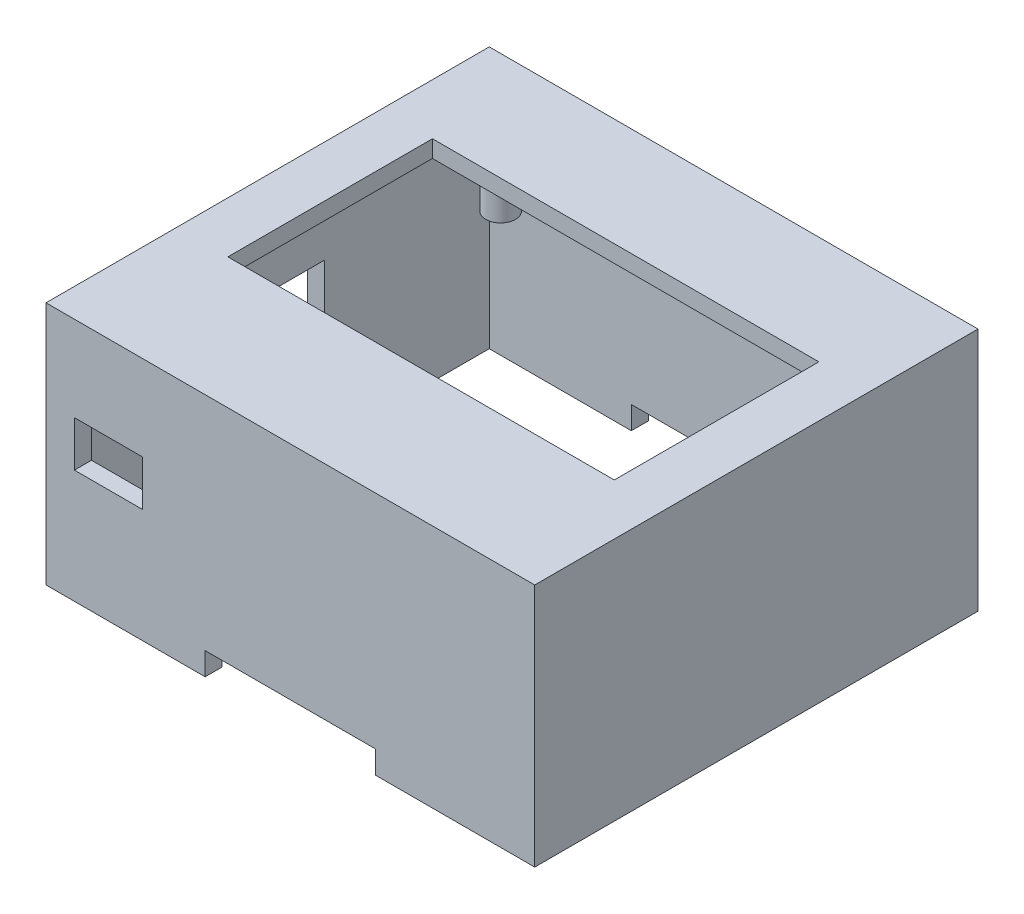
ISO-10303-21;
HEADER;
FILE_DESCRIPTION(('STEP AP214'),'2;1');
FILE_NAME('part.step','',(''),(''),'','','');
FILE_SCHEMA(('AUTOMOTIVE_DESIGN { 1 0 10303 214 1 1 1 1 }'));
ENDSEC;
DATA;
#1=APPLICATION_CONTEXT('core data for automotive mechanical design processes');
#2=APPLICATION_PROTOCOL_DEFINITION('international standard','automotive_design',2000,#1);
#3=PRODUCT_CONTEXT('',#1,'mechanical');
#4=PRODUCT('Part','Part','',(#3));
#5=PRODUCT_RELATED_PRODUCT_CATEGORY('part','',(#4));
#6=PRODUCT_DEFINITION_FORMATION('','',#4);
#7=PRODUCT_DEFINITION_CONTEXT('part definition',#1,'design');
#8=PRODUCT_DEFINITION('design','',#6,#7);
#9=PRODUCT_DEFINITION_SHAPE('','',#8);
#10=(LENGTH_UNIT() NAMED_UNIT(*) SI_UNIT(.MILLI.,.METRE.));
#11=(NAMED_UNIT(*) PLANE_ANGLE_UNIT() SI_UNIT($,.RADIAN.));
#12=(NAMED_UNIT(*) SI_UNIT($,.STERADIAN.) SOLID_ANGLE_UNIT());
#13=UNCERTAINTY_MEASURE_WITH_UNIT(LENGTH_MEASURE(1.E-05),#10,'distance_accuracy_value','');
#14=(GEOMETRIC_REPRESENTATION_CONTEXT(3) GLOBAL_UNCERTAINTY_ASSIGNED_CONTEXT((#13)) GLOBAL_UNIT_ASSIGNED_CONTEXT((#10,
#11,#12)) REPRESENTATION_CONTEXT('',''));
#15=CARTESIAN_POINT('',(0.,0.,0.));
#16=DIRECTION('',(0.,0.,1.));
#17=DIRECTION('',(1.,0.,0.));
#18=AXIS2_PLACEMENT_3D('',#15,#16,#17);
#19=CARTESIAN_POINT('',(-21.5,1.5,-19.5));
#20=DIRECTION('',(0.,0.,1.));
#21=DIRECTION('',(1.,0.,0.));
#22=AXIS2_PLACEMENT_3D('',#19,#20,#21);
#23=PLANE('',#22);
#24=DIRECTION('',(0.,-1.,0.));
#25=VECTOR('',#24,1.);
#26=CARTESIAN_POINT('',(7.5,-18.,-19.5));
#27=LINE('',#26,#25);
#28=CARTESIAN_POINT('',(7.5,-18.,-19.5));
#29=VERTEX_POINT('',#28);
#30=CARTESIAN_POINT('',(7.5,-20.,-19.5));
#31=VERTEX_POINT('',#30);
#32=EDGE_CURVE('E255',#29,#31,#27,.T.);
#33=ORIENTED_EDGE('',*,*,#32,.F.);
#34=DIRECTION('',(1.,0.,0.));
#35=VECTOR('',#34,1.);
#36=CARTESIAN_POINT('',(0.,-18.,-19.5));
#37=LINE('',#36,#35);
#38=CARTESIAN_POINT('',(-7.5,-18.,-19.5));
#39=VERTEX_POINT('',#38);
#40=EDGE_CURVE('E237',#39,#29,#37,.T.);
#41=ORIENTED_EDGE('',*,*,#40,.F.);
#42=DIRECTION('',(0.,-1.,0.));
#43=VECTOR('',#42,1.);
#44=CARTESIAN_POINT('',(-7.5,-18.,-19.5));
#45=LINE('',#44,#43);
#46=CARTESIAN_POINT('',(-7.5,-20.,-19.5));
#47=VERTEX_POINT('',#46);
#48=EDGE_CURVE('E234',#39,#47,#45,.T.);
#49=ORIENTED_EDGE('',*,*,#48,.T.);
#50=DIRECTION('',(1.,0.,0.));
#51=VECTOR('',#50,1.);
#52=CARTESIAN_POINT('',(-21.5,-20.,-19.5));
#53=LINE('',#52,#51);
#54=CARTESIAN_POINT('',(-21.5,-20.,-19.5));
#55=VERTEX_POINT('',#54);
#56=EDGE_CURVE('E426',#55,#47,#53,.T.);
#57=ORIENTED_EDGE('',*,*,#56,.F.);
#58=DIRECTION('',(0.,-1.,0.));
#59=VECTOR('',#58,1.);
#60=CARTESIAN_POINT('',(-21.5,1.5,-19.5));
#61=LINE('',#60,#59);
#62=CARTESIAN_POINT('',(-21.5,1.5,-19.5));
#63=VERTEX_POINT('',#62);
#64=EDGE_CURVE('E514',#63,#55,#61,.T.);
#65=ORIENTED_EDGE('',*,*,#64,.F.);
#66=DIRECTION('',(-1.,0.,0.));
#67=VECTOR('',#66,1.);
#68=CARTESIAN_POINT('',(-21.5,1.5,-19.5));
#69=LINE('',#68,#67);
#70=CARTESIAN_POINT('',(21.5,1.5,-19.5));
#71=VERTEX_POINT('',#70);
#72=EDGE_CURVE('E498',#71,#63,#69,.T.);
#73=ORIENTED_EDGE('',*,*,#72,.F.);
#74=DIRECTION('',(0.,-1.,0.));
#75=VECTOR('',#74,1.);
#76=CARTESIAN_POINT('',(21.5,1.5,-19.5));
#77=LINE('',#76,#75);
#78=CARTESIAN_POINT('',(21.5,-20.,-19.5));
#79=VERTEX_POINT('',#78);
#80=EDGE_CURVE('E517',#71,#79,#77,.T.);
#81=ORIENTED_EDGE('',*,*,#80,.T.);
#82=EDGE_CURVE('E425',#31,#79,#53,.T.);
#83=ORIENTED_EDGE('',*,*,#82,.F.);
#84=EDGE_LOOP('',(#33,#41,#49,#57,#65,#73,#81,#83));
#85=FACE_BOUND('',#84,.T.);
#86=ADVANCED_FACE('F41',(#85),#23,.F.);
#87=CARTESIAN_POINT('',(-21.5,1.5,19.5));
#88=DIRECTION('',(0.,0.,-1.));
#89=DIRECTION('',(-1.,0.,0.));
#90=AXIS2_PLACEMENT_3D('',#87,#88,#89);
#91=PLANE('',#90);
#92=DIRECTION('',(1.,0.,0.));
#93=VECTOR('',#92,1.);
#94=CARTESIAN_POINT('',(-13.,-10.,19.5));
#95=LINE('',#94,#93);
#96=CARTESIAN_POINT('',(-19.,-10.,19.5));
#97=VERTEX_POINT('',#96);
#98=CARTESIAN_POINT('',(-13.,-10.,19.5));
#99=VERTEX_POINT('',#98);
#100=EDGE_CURVE('E308',#97,#99,#95,.T.);
#101=ORIENTED_EDGE('',*,*,#100,.F.);
#102=DIRECTION('',(0.,-1.,0.));
#103=VECTOR('',#102,1.);
#104=CARTESIAN_POINT('',(-19.,-10.,19.5));
#105=LINE('',#104,#103);
#106=CARTESIAN_POINT('',(-19.,-6.,19.5));
#107=VERTEX_POINT('',#106);
#108=EDGE_CURVE('E312',#107,#97,#105,.T.);
#109=ORIENTED_EDGE('',*,*,#108,.F.);
#110=DIRECTION('',(-1.,0.,0.));
#111=VECTOR('',#110,1.);
#112=CARTESIAN_POINT('',(-13.,-6.,19.5));
#113=LINE('',#112,#111);
#114=CARTESIAN_POINT('',(-13.,-6.,19.5));
#115=VERTEX_POINT('',#114);
#116=EDGE_CURVE('E299',#115,#107,#113,.T.);
#117=ORIENTED_EDGE('',*,*,#116,.F.);
#118=DIRECTION('',(0.,1.,0.));
#119=VECTOR('',#118,1.);
#120=CARTESIAN_POINT('',(-13.,-10.,19.5));
#121=LINE('',#120,#119);
#122=EDGE_CURVE('E304',#99,#115,#121,.T.);
#123=ORIENTED_EDGE('',*,*,#122,.F.);
#124=EDGE_LOOP('',(#101,#109,#117,#123));
#125=FACE_BOUND('',#124,.T.);
#126=DIRECTION('',(0.,-1.,0.));
#127=VECTOR('',#126,1.);
#128=CARTESIAN_POINT('',(7.5,-18.,19.5));
#129=LINE('',#128,#127);
#130=CARTESIAN_POINT('',(7.5,-18.,19.5));
#131=VERTEX_POINT('',#130);
#132=CARTESIAN_POINT('',(7.5,-20.,19.5));
#133=VERTEX_POINT('',#132);
#134=EDGE_CURVE('E272',#131,#133,#129,.T.);
#135=ORIENTED_EDGE('',*,*,#134,.T.);
#136=DIRECTION('',(-1.,0.,0.));
#137=VECTOR('',#136,1.);
#138=CARTESIAN_POINT('',(21.5,-20.,19.5));
#139=LINE('',#138,#137);
#140=CARTESIAN_POINT('',(21.5,-20.,19.5));
#141=VERTEX_POINT('',#140);
#142=EDGE_CURVE('E435',#141,#133,#139,.T.);
#143=ORIENTED_EDGE('',*,*,#142,.F.);
#144=DIRECTION('',(0.,-1.,0.));
#145=VECTOR('',#144,1.);
#146=CARTESIAN_POINT('',(21.5,1.5,19.5));
#147=LINE('',#146,#145);
#148=CARTESIAN_POINT('',(21.5,1.5,19.5));
#149=VERTEX_POINT('',#148);
#150=EDGE_CURVE('E507',#149,#141,#147,.T.);
#151=ORIENTED_EDGE('',*,*,#150,.F.);
#152=DIRECTION('',(1.,0.,0.));
#153=VECTOR('',#152,1.);
#154=CARTESIAN_POINT('',(-21.5,1.5,19.5));
#155=LINE('',#154,#153);
#156=CARTESIAN_POINT('',(-21.5,1.5,19.5));
#157=VERTEX_POINT('',#156);
#158=EDGE_CURVE('E504',#157,#149,#155,.T.);
#159=ORIENTED_EDGE('',*,*,#158,.F.);
#160=DIRECTION('',(0.,-1.,0.));
#161=VECTOR('',#160,1.);
#162=CARTESIAN_POINT('',(-21.5,1.5,19.5));
#163=LINE('',#162,#161);
#164=CARTESIAN_POINT('',(-21.5,-20.,19.5));
#165=VERTEX_POINT('',#164);
#166=EDGE_CURVE('E510',#157,#165,#163,.T.);
#167=ORIENTED_EDGE('',*,*,#166,.T.);
#168=CARTESIAN_POINT('',(-7.5,-20.,19.5));
#169=VERTEX_POINT('',#168);
#170=EDGE_CURVE('E434',#169,#165,#139,.T.);
#171=ORIENTED_EDGE('',*,*,#170,.F.);
#172=DIRECTION('',(0.,-1.,0.));
#173=VECTOR('',#172,1.);
#174=CARTESIAN_POINT('',(-7.5,-18.,19.5));
#175=LINE('',#174,#173);
#176=CARTESIAN_POINT('',(-7.5,-18.,19.5));
#177=VERTEX_POINT('',#176);
#178=EDGE_CURVE('E287',#177,#169,#175,.T.);
#179=ORIENTED_EDGE('',*,*,#178,.F.);
#180=DIRECTION('',(-1.,0.,0.));
#181=VECTOR('',#180,1.);
#182=CARTESIAN_POINT('',(0.,-18.,19.5));
#183=LINE('',#182,#181);
#184=EDGE_CURVE('E263',#131,#177,#183,.T.);
#185=ORIENTED_EDGE('',*,*,#184,.F.);
#186=EDGE_LOOP('',(#135,#143,#151,#159,#167,#171,#179,#185));
#187=FACE_BOUND('',#186,.T.);
#188=ADVANCED_FACE('F544',(#125,#187),#91,.F.);
#189=CARTESIAN_POINT('',(0.,-20.,0.));
#190=DIRECTION('',(0.,-1.,0.));
#191=DIRECTION('',(0.,0.,-1.));
#192=AXIS2_PLACEMENT_3D('',#189,#190,#191);
#193=PLANE('',#192);
#194=DIRECTION('',(1.,0.,0.));
#195=VECTOR('',#194,1.);
#196=CARTESIAN_POINT('',(-20.,-20.,-18.));
#197=LINE('',#196,#195);
#198=CARTESIAN_POINT('',(7.5,-20.,-18.));
#199=VERTEX_POINT('',#198);
#200=CARTESIAN_POINT('',(20.,-20.,-18.));
#201=VERTEX_POINT('',#200);
#202=EDGE_CURVE('E395',#199,#201,#197,.T.);
#203=ORIENTED_EDGE('',*,*,#202,.F.);
#204=DIRECTION('',(0.,0.,-1.));
#205=VECTOR('',#204,1.);
#206=CARTESIAN_POINT('',(7.5,-20.,0.));
#207=LINE('',#206,#205);
#208=EDGE_CURVE('E282',#199,#31,#207,.T.);
#209=ORIENTED_EDGE('',*,*,#208,.T.);
#210=ORIENTED_EDGE('',*,*,#82,.T.);
#211=DIRECTION('',(0.,0.,1.));
#212=VECTOR('',#211,1.);
#213=CARTESIAN_POINT('',(21.5,-20.,-19.5));
#214=LINE('',#213,#212);
#215=EDGE_CURVE('E430',#79,#141,#214,.T.);
#216=ORIENTED_EDGE('',*,*,#215,.T.);
#217=ORIENTED_EDGE('',*,*,#142,.T.);
#218=DIRECTION('',(0.,0.,-1.));
#219=VECTOR('',#218,1.);
#220=CARTESIAN_POINT('',(7.5,-20.,0.));
#221=LINE('',#220,#219);
#222=CARTESIAN_POINT('',(7.5,-20.,18.));
#223=VERTEX_POINT('',#222);
#224=EDGE_CURVE('E273',#133,#223,#221,.T.);
#225=ORIENTED_EDGE('',*,*,#224,.T.);
#226=DIRECTION('',(-1.,0.,0.));
#227=VECTOR('',#226,1.);
#228=CARTESIAN_POINT('',(20.,-20.,18.));
#229=LINE('',#228,#227);
#230=CARTESIAN_POINT('',(20.,-20.,18.));
#231=VERTEX_POINT('',#230);
#232=EDGE_CURVE('E387',#231,#223,#229,.T.);
#233=ORIENTED_EDGE('',*,*,#232,.F.);
#234=DIRECTION('',(0.,0.,1.));
#235=VECTOR('',#234,1.);
#236=CARTESIAN_POINT('',(20.,-20.,-18.));
#237=LINE('',#236,#235);
#238=EDGE_CURVE('E382',#201,#231,#237,.T.);
#239=ORIENTED_EDGE('',*,*,#238,.F.);
#240=EDGE_LOOP('',(#203,#209,#210,#216,#217,#225,#233,#239));
#241=FACE_BOUND('',#240,.T.);
#242=ADVANCED_FACE('F549',(#241),#193,.T.);
#243=DIRECTION('',(0.,0.,-1.));
#244=VECTOR('',#243,1.);
#245=CARTESIAN_POINT('',(-7.5,-20.,0.));
#246=LINE('',#245,#244);
#247=CARTESIAN_POINT('',(-7.5,-20.,-18.));
#248=VERTEX_POINT('',#247);
#249=EDGE_CURVE('E579',#248,#47,#246,.T.);
#250=ORIENTED_EDGE('',*,*,#249,.F.);
#251=CARTESIAN_POINT('',(-20.,-20.,-18.));
#252=VERTEX_POINT('',#251);
#253=EDGE_CURVE('E249',#252,#248,#197,.T.);
#254=ORIENTED_EDGE('',*,*,#253,.F.);
#255=DIRECTION('',(0.,0.,-1.));
#256=VECTOR('',#255,1.);
#257=CARTESIAN_POINT('',(-20.,-20.,18.));
#258=LINE('',#257,#256);
#259=CARTESIAN_POINT('',(-20.,-20.,18.));
#260=VERTEX_POINT('',#259);
#261=EDGE_CURVE('E391',#260,#252,#258,.T.);
#262=ORIENTED_EDGE('',*,*,#261,.F.);
#263=CARTESIAN_POINT('',(-7.5,-20.,18.));
#264=VERTEX_POINT('',#263);
#265=EDGE_CURVE('E385',#264,#260,#229,.T.);
#266=ORIENTED_EDGE('',*,*,#265,.F.);
#267=DIRECTION('',(0.,0.,-1.));
#268=VECTOR('',#267,1.);
#269=CARTESIAN_POINT('',(-7.5,-20.,0.));
#270=LINE('',#269,#268);
#271=EDGE_CURVE('E264',#169,#264,#270,.T.);
#272=ORIENTED_EDGE('',*,*,#271,.F.);
#273=ORIENTED_EDGE('',*,*,#170,.T.);
#274=DIRECTION('',(0.,0.,-1.));
#275=VECTOR('',#274,1.);
#276=CARTESIAN_POINT('',(-21.5,-20.,19.5));
#277=LINE('',#276,#275);
#278=EDGE_CURVE('E439',#165,#55,#277,.T.);
#279=ORIENTED_EDGE('',*,*,#278,.T.);
#280=ORIENTED_EDGE('',*,*,#56,.T.);
#281=EDGE_LOOP('',(#250,#254,#262,#266,#272,#273,#279,#280));
#282=FACE_BOUND('',#281,.T.);
#283=ADVANCED_FACE('F569',(#282),#193,.T.);
#284=CARTESIAN_POINT('',(20.,-20.,18.));
#285=DIRECTION('',(0.,0.,-1.));
#286=DIRECTION('',(-1.,0.,0.));
#287=AXIS2_PLACEMENT_3D('',#284,#285,#286);
#288=PLANE('',#287);
#289=DIRECTION('',(0.,-1.,0.));
#290=VECTOR('',#289,1.);
#291=CARTESIAN_POINT('',(-19.,-10.,18.));
#292=LINE('',#291,#290);
#293=CARTESIAN_POINT('',(-19.,-6.,18.));
#294=VERTEX_POINT('',#293);
#295=CARTESIAN_POINT('',(-19.,-10.,18.));
#296=VERTEX_POINT('',#295);
#297=EDGE_CURVE('E315',#294,#296,#292,.T.);
#298=ORIENTED_EDGE('',*,*,#297,.T.);
#299=DIRECTION('',(1.,0.,0.));
#300=VECTOR('',#299,1.);
#301=CARTESIAN_POINT('',(-13.,-10.,18.));
#302=LINE('',#301,#300);
#303=CARTESIAN_POINT('',(-13.,-10.,18.));
#304=VERTEX_POINT('',#303);
#305=EDGE_CURVE('E293',#296,#304,#302,.T.);
#306=ORIENTED_EDGE('',*,*,#305,.T.);
#307=DIRECTION('',(0.,1.,0.));
#308=VECTOR('',#307,1.);
#309=CARTESIAN_POINT('',(-13.,-10.,18.));
#310=LINE('',#309,#308);
#311=CARTESIAN_POINT('',(-13.,-6.,18.));
#312=VERTEX_POINT('',#311);
#313=EDGE_CURVE('E325',#304,#312,#310,.T.);
#314=ORIENTED_EDGE('',*,*,#313,.T.);
#315=DIRECTION('',(-1.,0.,0.));
#316=VECTOR('',#315,1.);
#317=CARTESIAN_POINT('',(-13.,-6.,18.));
#318=LINE('',#317,#316);
#319=EDGE_CURVE('E320',#312,#294,#318,.T.);
#320=ORIENTED_EDGE('',*,*,#319,.T.);
#321=EDGE_LOOP('',(#298,#306,#314,#320));
#322=FACE_BOUND('',#321,.T.);
#323=ORIENTED_EDGE('',*,*,#232,.T.);
#324=DIRECTION('',(0.,-1.,0.));
#325=VECTOR('',#324,1.);
#326=CARTESIAN_POINT('',(7.5,-18.,18.));
#327=LINE('',#326,#325);
#328=CARTESIAN_POINT('',(7.5,-18.,18.));
#329=VERTEX_POINT('',#328);
#330=EDGE_CURVE('E279',#329,#223,#327,.T.);
#331=ORIENTED_EDGE('',*,*,#330,.F.);
#332=DIRECTION('',(1.,0.,0.));
#333=VECTOR('',#332,1.);
#334=CARTESIAN_POINT('',(0.,-18.,18.));
#335=LINE('',#334,#333);
#336=CARTESIAN_POINT('',(-7.5,-18.,18.));
#337=VERTEX_POINT('',#336);
#338=EDGE_CURVE('E269',#337,#329,#335,.T.);
#339=ORIENTED_EDGE('',*,*,#338,.F.);
#340=DIRECTION('',(0.,-1.,0.));
#341=VECTOR('',#340,1.);
#342=CARTESIAN_POINT('',(-7.5,-18.,18.));
#343=LINE('',#342,#341);
#344=EDGE_CURVE('E283',#337,#264,#343,.T.);
#345=ORIENTED_EDGE('',*,*,#344,.T.);
#346=ORIENTED_EDGE('',*,*,#265,.T.);
#347=DIRECTION('',(0.,1.,0.));
#348=VECTOR('',#347,1.);
#349=CARTESIAN_POINT('',(-20.,-20.,18.));
#350=LINE('',#349,#348);
#351=CARTESIAN_POINT('',(-20.,0.,18.));
#352=VERTEX_POINT('',#351);
#353=EDGE_CURVE('E418',#260,#352,#350,.T.);
#354=ORIENTED_EDGE('',*,*,#353,.T.);
#355=DIRECTION('',(-1.,0.,0.));
#356=VECTOR('',#355,1.);
#357=CARTESIAN_POINT('',(20.,0.,18.));
#358=LINE('',#357,#356);
#359=CARTESIAN_POINT('',(20.,0.,18.));
#360=VERTEX_POINT('',#359);
#361=EDGE_CURVE('E402',#360,#352,#358,.T.);
#362=ORIENTED_EDGE('',*,*,#361,.F.);
#363=DIRECTION('',(0.,1.,0.));
#364=VECTOR('',#363,1.);
#365=CARTESIAN_POINT('',(20.,-20.,18.));
#366=LINE('',#365,#364);
#367=EDGE_CURVE('E421',#231,#360,#366,.T.);
#368=ORIENTED_EDGE('',*,*,#367,.F.);
#369=EDGE_LOOP('',(#323,#331,#339,#345,#346,#354,#362,#368));
#370=FACE_BOUND('',#369,.T.);
#371=ADVANCED_FACE('F595',(#322,#370),#288,.T.);
#372=CARTESIAN_POINT('',(-20.,-20.,-18.));
#373=DIRECTION('',(0.,0.,1.));
#374=DIRECTION('',(1.,0.,0.));
#375=AXIS2_PLACEMENT_3D('',#372,#373,#374);
#376=PLANE('',#375);
#377=DIRECTION('',(-1.,0.,0.));
#378=VECTOR('',#377,1.);
#379=CARTESIAN_POINT('',(0.,-18.,-18.));
#380=LINE('',#379,#378);
#381=CARTESIAN_POINT('',(7.5,-18.,-18.));
#382=VERTEX_POINT('',#381);
#383=CARTESIAN_POINT('',(-7.5,-18.,-18.));
#384=VERTEX_POINT('',#383);
#385=EDGE_CURVE('E238',#382,#384,#380,.T.);
#386=ORIENTED_EDGE('',*,*,#385,.F.);
#387=DIRECTION('',(0.,-1.,0.));
#388=VECTOR('',#387,1.);
#389=CARTESIAN_POINT('',(7.5,-18.,-18.));
#390=LINE('',#389,#388);
#391=EDGE_CURVE('E251',#382,#199,#390,.T.);
#392=ORIENTED_EDGE('',*,*,#391,.T.);
#393=ORIENTED_EDGE('',*,*,#202,.T.);
#394=DIRECTION('',(0.,1.,0.));
#395=VECTOR('',#394,1.);
#396=CARTESIAN_POINT('',(20.,-20.,-18.));
#397=LINE('',#396,#395);
#398=CARTESIAN_POINT('',(20.,0.,-18.));
#399=VERTEX_POINT('',#398);
#400=EDGE_CURVE('E398',#201,#399,#397,.T.);
#401=ORIENTED_EDGE('',*,*,#400,.T.);
#402=DIRECTION('',(1.,0.,0.));
#403=VECTOR('',#402,1.);
#404=CARTESIAN_POINT('',(-20.,0.,-18.));
#405=LINE('',#404,#403);
#406=CARTESIAN_POINT('',(-20.,0.,-18.));
#407=VERTEX_POINT('',#406);
#408=EDGE_CURVE('E386',#407,#399,#405,.T.);
#409=ORIENTED_EDGE('',*,*,#408,.F.);
#410=DIRECTION('',(0.,1.,0.));
#411=VECTOR('',#410,1.);
#412=CARTESIAN_POINT('',(-20.,-20.,-18.));
#413=LINE('',#412,#411);
#414=EDGE_CURVE('E415',#252,#407,#413,.T.);
#415=ORIENTED_EDGE('',*,*,#414,.F.);
#416=ORIENTED_EDGE('',*,*,#253,.T.);
#417=DIRECTION('',(0.,-1.,0.));
#418=VECTOR('',#417,1.);
#419=CARTESIAN_POINT('',(-7.5,-18.,-18.));
#420=LINE('',#419,#418);
#421=EDGE_CURVE('E231',#384,#248,#420,.T.);
#422=ORIENTED_EDGE('',*,*,#421,.F.);
#423=EDGE_LOOP('',(#386,#392,#393,#401,#409,#415,#416,#422));
#424=FACE_BOUND('',#423,.T.);
#425=ADVANCED_FACE('F247',(#424),#376,.T.);
#426=CARTESIAN_POINT('',(21.5,1.5,-19.5));
#427=DIRECTION('',(-1.,0.,0.));
#428=DIRECTION('',(0.,0.,1.));
#429=AXIS2_PLACEMENT_3D('',#426,#427,#428);
#430=PLANE('',#429);
#431=ORIENTED_EDGE('',*,*,#150,.T.);
#432=ORIENTED_EDGE('',*,*,#215,.F.);
#433=ORIENTED_EDGE('',*,*,#80,.F.);
#434=DIRECTION('',(0.,0.,-1.));
#435=VECTOR('',#434,1.);
#436=CARTESIAN_POINT('',(21.5,1.5,-19.5));
#437=LINE('',#436,#435);
#438=EDGE_CURVE('E494',#149,#71,#437,.T.);
#439=ORIENTED_EDGE('',*,*,#438,.F.);
#440=EDGE_LOOP('',(#431,#432,#433,#439));
#441=FACE_BOUND('',#440,.T.);
#442=ADVANCED_FACE('F43',(#441),#430,.F.);
#443=CARTESIAN_POINT('',(-21.5,1.5,-19.5));
#444=DIRECTION('',(1.,0.,0.));
#445=DIRECTION('',(0.,0.,-1.));
#446=AXIS2_PLACEMENT_3D('',#443,#444,#445);
#447=PLANE('',#446);
#448=DIRECTION('',(0.,1.,0.));
#449=VECTOR('',#448,1.);
#450=CARTESIAN_POINT('',(-21.5,-11.,8.50000000000001));
#451=LINE('',#450,#449);
#452=CARTESIAN_POINT('',(-21.5,-11.,8.50000000000001));
#453=VERTEX_POINT('',#452);
#454=CARTESIAN_POINT('',(-21.5,-6.,8.50000000000001));
#455=VERTEX_POINT('',#454);
#456=EDGE_CURVE('E357',#453,#455,#451,.T.);
#457=ORIENTED_EDGE('',*,*,#456,.F.);
#458=DIRECTION('',(0.,0.,1.));
#459=VECTOR('',#458,1.);
#460=CARTESIAN_POINT('',(-21.5,-11.,8.50000000000001));
#461=LINE('',#460,#459);
#462=CARTESIAN_POINT('',(-21.5,-11.,-3.49999999999999));
#463=VERTEX_POINT('',#462);
#464=EDGE_CURVE('E353',#463,#453,#461,.T.);
#465=ORIENTED_EDGE('',*,*,#464,.F.);
#466=DIRECTION('',(0.,-1.,0.));
#467=VECTOR('',#466,1.);
#468=CARTESIAN_POINT('',(-21.5,-11.,-3.49999999999999));
#469=LINE('',#468,#467);
#470=CARTESIAN_POINT('',(-21.5,-6.,-3.49999999999999));
#471=VERTEX_POINT('',#470);
#472=EDGE_CURVE('E349',#471,#463,#469,.T.);
#473=ORIENTED_EDGE('',*,*,#472,.F.);
#474=DIRECTION('',(0.,0.,-1.));
#475=VECTOR('',#474,1.);
#476=CARTESIAN_POINT('',(-21.5,-6.,8.50000000000001));
#477=LINE('',#476,#475);
#478=EDGE_CURVE('E361',#455,#471,#477,.T.);
#479=ORIENTED_EDGE('',*,*,#478,.F.);
#480=EDGE_LOOP('',(#457,#465,#473,#479));
#481=FACE_BOUND('',#480,.T.);
#482=ORIENTED_EDGE('',*,*,#64,.T.);
#483=ORIENTED_EDGE('',*,*,#278,.F.);
#484=ORIENTED_EDGE('',*,*,#166,.F.);
#485=DIRECTION('',(0.,0.,1.));
#486=VECTOR('',#485,1.);
#487=CARTESIAN_POINT('',(-21.5,1.5,-19.5));
#488=LINE('',#487,#486);
#489=EDGE_CURVE('E501',#63,#157,#488,.T.);
#490=ORIENTED_EDGE('',*,*,#489,.F.);
#491=EDGE_LOOP('',(#482,#483,#484,#490));
#492=FACE_BOUND('',#491,.T.);
#493=ADVANCED_FACE('F538',(#481,#492),#447,.F.);
#494=CARTESIAN_POINT('',(0.,1.5,0.));
#495=DIRECTION('',(0.,1.,0.));
#496=DIRECTION('',(0.,0.,1.));
#497=AXIS2_PLACEMENT_3D('',#494,#495,#496);
#498=PLANE('',#497);
#499=DIRECTION('',(-1.,0.,0.));
#500=VECTOR('',#499,1.);
#501=CARTESIAN_POINT('',(17.,1.5,-10.));
#502=LINE('',#501,#500);
#503=CARTESIAN_POINT('',(17.,1.5,-10.));
#504=VERTEX_POINT('',#503);
#505=CARTESIAN_POINT('',(-17.,1.5,-10.));
#506=VERTEX_POINT('',#505);
#507=EDGE_CURVE('E454',#504,#506,#502,.T.);
#508=ORIENTED_EDGE('',*,*,#507,.F.);
#509=DIRECTION('',(0.,0.,-1.));
#510=VECTOR('',#509,1.);
#511=CARTESIAN_POINT('',(17.,1.5,8.));
#512=LINE('',#511,#510);
#513=CARTESIAN_POINT('',(17.,1.5,8.));
#514=VERTEX_POINT('',#513);
#515=EDGE_CURVE('E465',#514,#504,#512,.T.);
#516=ORIENTED_EDGE('',*,*,#515,.F.);
#517=DIRECTION('',(1.,0.,0.));
#518=VECTOR('',#517,1.);
#519=CARTESIAN_POINT('',(17.,1.5,8.));
#520=LINE('',#519,#518);
#521=CARTESIAN_POINT('',(-17.,1.5,8.));
#522=VERTEX_POINT('',#521);
#523=EDGE_CURVE('E461',#522,#514,#520,.T.);
#524=ORIENTED_EDGE('',*,*,#523,.F.);
#525=DIRECTION('',(0.,0.,1.));
#526=VECTOR('',#525,1.);
#527=CARTESIAN_POINT('',(-17.,1.5,8.));
#528=LINE('',#527,#526);
#529=EDGE_CURVE('E457',#506,#522,#528,.T.);
#530=ORIENTED_EDGE('',*,*,#529,.F.);
#531=EDGE_LOOP('',(#508,#516,#524,#530));
#532=FACE_BOUND('',#531,.T.);
#533=ORIENTED_EDGE('',*,*,#438,.T.);
#534=ORIENTED_EDGE('',*,*,#72,.T.);
#535=ORIENTED_EDGE('',*,*,#489,.T.);
#536=ORIENTED_EDGE('',*,*,#158,.T.);
#537=EDGE_LOOP('',(#533,#534,#535,#536));
#538=FACE_BOUND('',#537,.T.);
#539=ADVANCED_FACE('F528',(#532,#538),#498,.T.);
#540=CARTESIAN_POINT('',(0.,0.,0.));
#541=DIRECTION('',(0.,1.,0.));
#542=DIRECTION('',(0.,0.,1.));
#543=AXIS2_PLACEMENT_3D('',#540,#541,#542);
#544=PLANE('',#543);
#545=ORIENTED_EDGE('',*,*,#408,.T.);
#546=DIRECTION('',(0.,0.,1.));
#547=VECTOR('',#546,1.);
#548=CARTESIAN_POINT('',(20.,0.,-18.));
#549=LINE('',#548,#547);
#550=EDGE_CURVE('E381',#399,#360,#549,.T.);
#551=ORIENTED_EDGE('',*,*,#550,.T.);
#552=ORIENTED_EDGE('',*,*,#361,.T.);
#553=DIRECTION('',(0.,0.,-1.));
#554=VECTOR('',#553,1.);
#555=CARTESIAN_POINT('',(-20.,0.,18.));
#556=LINE('',#555,#554);
#557=EDGE_CURVE('E406',#352,#407,#556,.T.);
#558=ORIENTED_EDGE('',*,*,#557,.T.);
#559=EDGE_LOOP('',(#545,#551,#552,#558));
#560=FACE_BOUND('',#559,.T.);
#561=DIRECTION('',(0.,0.,1.));
#562=VECTOR('',#561,1.);
#563=CARTESIAN_POINT('',(17.,0.,8.));
#564=LINE('',#563,#562);
#565=CARTESIAN_POINT('',(17.,0.,-10.));
#566=VERTEX_POINT('',#565);
#567=CARTESIAN_POINT('',(17.,0.,8.));
#568=VERTEX_POINT('',#567);
#569=EDGE_CURVE('E446',#566,#568,#564,.T.);
#570=ORIENTED_EDGE('',*,*,#569,.F.);
#571=DIRECTION('',(1.,0.,0.));
#572=VECTOR('',#571,1.);
#573=CARTESIAN_POINT('',(17.,0.,-10.));
#574=LINE('',#573,#572);
#575=CARTESIAN_POINT('',(-17.,0.,-9.99999999999999));
#576=VERTEX_POINT('',#575);
#577=EDGE_CURVE('E450',#576,#566,#574,.T.);
#578=ORIENTED_EDGE('',*,*,#577,.F.);
#579=DIRECTION('',(0.,0.,-1.));
#580=VECTOR('',#579,1.);
#581=CARTESIAN_POINT('',(-17.,0.,8.));
#582=LINE('',#581,#580);
#583=CARTESIAN_POINT('',(-17.,0.,8.));
#584=VERTEX_POINT('',#583);
#585=EDGE_CURVE('E473',#584,#576,#582,.T.);
#586=ORIENTED_EDGE('',*,*,#585,.F.);
#587=DIRECTION('',(-1.,0.,0.));
#588=VECTOR('',#587,1.);
#589=CARTESIAN_POINT('',(17.,0.,8.));
#590=LINE('',#589,#588);
#591=EDGE_CURVE('E443',#568,#584,#590,.T.);
#592=ORIENTED_EDGE('',*,*,#591,.F.);
#593=EDGE_LOOP('',(#570,#578,#586,#592));
#594=FACE_BOUND('',#593,.T.);
#595=CARTESIAN_POINT('',(-15.,0.,-14.));
#596=DIRECTION('',(0.,1.,0.));
#597=DIRECTION('',(0.,0.,1.));
#598=AXIS2_PLACEMENT_3D('',#595,#596,#597);
#599=CIRCLE('',#598,1.3);
#600=CARTESIAN_POINT('',(-15.,0.,-12.7));
#601=VERTEX_POINT('',#600);
#602=EDGE_CURVE('E11',#601,#601,#599,.F.);
#603=ORIENTED_EDGE('',*,*,#602,.F.);
#604=EDGE_LOOP('',(#603));
#605=FACE_BOUND('',#604,.T.);
#606=CARTESIAN_POINT('',(15.,0.,14.));
#607=DIRECTION('',(0.,1.,0.));
#608=DIRECTION('',(0.,0.,1.));
#609=AXIS2_PLACEMENT_3D('',#606,#607,#608);
#610=CIRCLE('',#609,1.3);
#611=CARTESIAN_POINT('',(15.,0.,15.3));
#612=VERTEX_POINT('',#611);
#613=EDGE_CURVE('E50',#612,#612,#610,.F.);
#614=ORIENTED_EDGE('',*,*,#613,.F.);
#615=EDGE_LOOP('',(#614));
#616=FACE_BOUND('',#615,.T.);
#617=ADVANCED_FACE('F526',(#560,#594,#605,#616),#544,.F.);
#618=CARTESIAN_POINT('',(15.,-5.,14.));
#619=DIRECTION('',(0.,1.,0.));
#620=DIRECTION('',(0.,0.,1.));
#621=AXIS2_PLACEMENT_3D('',#618,#619,#620);
#622=CYLINDRICAL_SURFACE('',#621,1.3);
#623=CARTESIAN_POINT('',(15.,-5.,14.));
#624=DIRECTION('',(0.,-1.,0.));
#625=DIRECTION('',(0.,0.,-1.));
#626=AXIS2_PLACEMENT_3D('',#623,#624,#625);
#627=CIRCLE('',#626,1.3);
#628=CARTESIAN_POINT('',(15.,-5.,12.7));
#629=VERTEX_POINT('',#628);
#630=EDGE_CURVE('E490',#629,#629,#627,.T.);
#631=ORIENTED_EDGE('',*,*,#630,.F.);
#632=EDGE_LOOP('',(#631));
#633=FACE_BOUND('',#632,.T.);
#634=ORIENTED_EDGE('',*,*,#613,.T.);
#635=EDGE_LOOP('',(#634));
#636=FACE_BOUND('',#635,.T.);
#637=ADVANCED_FACE('F524',(#633,#636),#622,.T.);
#638=CARTESIAN_POINT('',(15.,-5.,14.));
#639=DIRECTION('',(0.,-1.,0.));
#640=DIRECTION('',(0.,0.,-1.));
#641=AXIS2_PLACEMENT_3D('',#638,#639,#640);
#642=PLANE('',#641);
#643=ORIENTED_EDGE('',*,*,#630,.T.);
#644=EDGE_LOOP('',(#643));
#645=FACE_BOUND('',#644,.T.);
#646=ADVANCED_FACE('F535',(#645),#642,.T.);
#647=CARTESIAN_POINT('',(-15.,-5.,-14.));
#648=DIRECTION('',(0.,1.,0.));
#649=DIRECTION('',(0.,0.,1.));
#650=AXIS2_PLACEMENT_3D('',#647,#648,#649);
#651=CYLINDRICAL_SURFACE('',#650,1.3);
#652=CARTESIAN_POINT('',(-15.,-5.,-14.));
#653=DIRECTION('',(0.,-1.,0.));
#654=DIRECTION('',(0.,0.,-1.));
#655=AXIS2_PLACEMENT_3D('',#652,#653,#654);
#656=CIRCLE('',#655,1.3);
#657=CARTESIAN_POINT('',(-15.,-5.,-15.3));
#658=VERTEX_POINT('',#657);
#659=EDGE_CURVE('E486',#658,#658,#656,.T.);
#660=ORIENTED_EDGE('',*,*,#659,.F.);
#661=EDGE_LOOP('',(#660));
#662=FACE_BOUND('',#661,.T.);
#663=ORIENTED_EDGE('',*,*,#602,.T.);
#664=EDGE_LOOP('',(#663));
#665=FACE_BOUND('',#664,.T.);
#666=ADVANCED_FACE('F690',(#662,#665),#651,.T.);
#667=CARTESIAN_POINT('',(-15.,-5.,-14.));
#668=DIRECTION('',(0.,-1.,0.));
#669=DIRECTION('',(0.,0.,-1.));
#670=AXIS2_PLACEMENT_3D('',#667,#668,#669);
#671=PLANE('',#670);
#672=ORIENTED_EDGE('',*,*,#659,.T.);
#673=EDGE_LOOP('',(#672));
#674=FACE_BOUND('',#673,.T.);
#675=ADVANCED_FACE('F686',(#674),#671,.T.);
#676=CARTESIAN_POINT('',(17.,-5.001,-10.));
#677=DIRECTION('',(0.,0.,-1.));
#678=DIRECTION('',(-1.,0.,0.));
#679=AXIS2_PLACEMENT_3D('',#676,#677,#678);
#680=PLANE('',#679);
#681=ORIENTED_EDGE('',*,*,#577,.T.);
#682=DIRECTION('',(0.,1.,0.));
#683=VECTOR('',#682,1.);
#684=CARTESIAN_POINT('',(17.,-5.001,-10.));
#685=LINE('',#684,#683);
#686=EDGE_CURVE('E470',#566,#504,#685,.T.);
#687=ORIENTED_EDGE('',*,*,#686,.T.);
#688=ORIENTED_EDGE('',*,*,#507,.T.);
#689=DIRECTION('',(0.,1.,0.));
#690=VECTOR('',#689,1.);
#691=CARTESIAN_POINT('',(-17.,-5.001,-10.));
#692=LINE('',#691,#690);
#693=EDGE_CURVE('E469',#576,#506,#692,.T.);
#694=ORIENTED_EDGE('',*,*,#693,.F.);
#695=EDGE_LOOP('',(#681,#687,#688,#694));
#696=FACE_BOUND('',#695,.T.);
#697=ADVANCED_FACE('F676',(#696),#680,.F.);
#698=CARTESIAN_POINT('',(17.,-5.001,8.));
#699=DIRECTION('',(1.,0.,0.));
#700=DIRECTION('',(0.,0.,-1.));
#701=AXIS2_PLACEMENT_3D('',#698,#699,#700);
#702=PLANE('',#701);
#703=ORIENTED_EDGE('',*,*,#569,.T.);
#704=DIRECTION('',(0.,1.,0.));
#705=VECTOR('',#704,1.);
#706=CARTESIAN_POINT('',(17.,-5.001,8.));
#707=LINE('',#706,#705);
#708=EDGE_CURVE('E474',#568,#514,#707,.T.);
#709=ORIENTED_EDGE('',*,*,#708,.T.);
#710=ORIENTED_EDGE('',*,*,#515,.T.);
#711=ORIENTED_EDGE('',*,*,#686,.F.);
#712=EDGE_LOOP('',(#703,#709,#710,#711));
#713=FACE_BOUND('',#712,.T.);
#714=ADVANCED_FACE('F672',(#713),#702,.F.);
#715=CARTESIAN_POINT('',(17.,-5.001,8.));
#716=DIRECTION('',(0.,0.,1.));
#717=DIRECTION('',(1.,0.,0.));
#718=AXIS2_PLACEMENT_3D('',#715,#716,#717);
#719=PLANE('',#718);
#720=ORIENTED_EDGE('',*,*,#591,.T.);
#721=DIRECTION('',(0.,1.,0.));
#722=VECTOR('',#721,1.);
#723=CARTESIAN_POINT('',(-17.,-5.001,8.));
#724=LINE('',#723,#722);
#725=EDGE_CURVE('E477',#584,#522,#724,.T.);
#726=ORIENTED_EDGE('',*,*,#725,.T.);
#727=ORIENTED_EDGE('',*,*,#523,.T.);
#728=ORIENTED_EDGE('',*,*,#708,.F.);
#729=EDGE_LOOP('',(#720,#726,#727,#728));
#730=FACE_BOUND('',#729,.T.);
#731=ADVANCED_FACE('F675',(#730),#719,.F.);
#732=CARTESIAN_POINT('',(-17.,-5.001,8.));
#733=DIRECTION('',(-1.,0.,0.));
#734=DIRECTION('',(0.,0.,1.));
#735=AXIS2_PLACEMENT_3D('',#732,#733,#734);
#736=PLANE('',#735);
#737=ORIENTED_EDGE('',*,*,#585,.T.);
#738=ORIENTED_EDGE('',*,*,#693,.T.);
#739=ORIENTED_EDGE('',*,*,#529,.T.);
#740=ORIENTED_EDGE('',*,*,#725,.F.);
#741=EDGE_LOOP('',(#737,#738,#739,#740));
#742=FACE_BOUND('',#741,.T.);
#743=ADVANCED_FACE('F669',(#742),#736,.F.);
#744=CARTESIAN_POINT('',(20.,-20.,-18.));
#745=DIRECTION('',(-1.,0.,0.));
#746=DIRECTION('',(0.,0.,1.));
#747=AXIS2_PLACEMENT_3D('',#744,#745,#746);
#748=PLANE('',#747);
#749=ORIENTED_EDGE('',*,*,#550,.F.);
#750=ORIENTED_EDGE('',*,*,#400,.F.);
#751=ORIENTED_EDGE('',*,*,#238,.T.);
#752=ORIENTED_EDGE('',*,*,#367,.T.);
#753=EDGE_LOOP('',(#749,#750,#751,#752));
#754=FACE_BOUND('',#753,.T.);
#755=ADVANCED_FACE('F606',(#754),#748,.T.);
#756=CARTESIAN_POINT('',(-20.,-20.,18.));
#757=DIRECTION('',(1.,0.,0.));
#758=DIRECTION('',(0.,0.,-1.));
#759=AXIS2_PLACEMENT_3D('',#756,#757,#758);
#760=PLANE('',#759);
#761=DIRECTION('',(0.,0.,1.));
#762=VECTOR('',#761,1.);
#763=CARTESIAN_POINT('',(-20.,-11.,8.49999999999999));
#764=LINE('',#763,#762);
#765=CARTESIAN_POINT('',(-20.,-11.,-3.49999999999999));
#766=VERTEX_POINT('',#765);
#767=CARTESIAN_POINT('',(-20.,-11.,8.5));
#768=VERTEX_POINT('',#767);
#769=EDGE_CURVE('E369',#766,#768,#764,.T.);
#770=ORIENTED_EDGE('',*,*,#769,.T.);
#771=DIRECTION('',(0.,1.,0.));
#772=VECTOR('',#771,1.);
#773=CARTESIAN_POINT('',(-20.,-11.,8.5));
#774=LINE('',#773,#772);
#775=CARTESIAN_POINT('',(-20.,-6.,8.50000000000001));
#776=VERTEX_POINT('',#775);
#777=EDGE_CURVE('E303',#768,#776,#774,.T.);
#778=ORIENTED_EDGE('',*,*,#777,.T.);
#779=DIRECTION('',(0.,0.,-1.));
#780=VECTOR('',#779,1.);
#781=CARTESIAN_POINT('',(-20.,-6.,8.49999999999999));
#782=LINE('',#781,#780);
#783=CARTESIAN_POINT('',(-20.,-6.,-3.5));
#784=VERTEX_POINT('',#783);
#785=EDGE_CURVE('E341',#776,#784,#782,.T.);
#786=ORIENTED_EDGE('',*,*,#785,.T.);
#787=DIRECTION('',(0.,-1.,0.));
#788=VECTOR('',#787,1.);
#789=CARTESIAN_POINT('',(-20.,-11.,-3.49999999999999));
#790=LINE('',#789,#788);
#791=EDGE_CURVE('E345',#784,#766,#790,.T.);
#792=ORIENTED_EDGE('',*,*,#791,.T.);
#793=EDGE_LOOP('',(#770,#778,#786,#792));
#794=FACE_BOUND('',#793,.T.);
#795=ORIENTED_EDGE('',*,*,#557,.F.);
#796=ORIENTED_EDGE('',*,*,#353,.F.);
#797=ORIENTED_EDGE('',*,*,#261,.T.);
#798=ORIENTED_EDGE('',*,*,#414,.T.);
#799=EDGE_LOOP('',(#795,#796,#797,#798));
#800=FACE_BOUND('',#799,.T.);
#801=ADVANCED_FACE('F600',(#794,#800),#760,.T.);
#802=CARTESIAN_POINT('',(21.501,-11.,8.5));
#803=DIRECTION('',(0.,-1.,0.));
#804=DIRECTION('',(0.,0.,-1.));
#805=AXIS2_PLACEMENT_3D('',#802,#803,#804);
#806=PLANE('',#805);
#807=DIRECTION('',(-1.,0.,0.));
#808=VECTOR('',#807,1.);
#809=CARTESIAN_POINT('',(21.501,-11.,-3.5));
#810=LINE('',#809,#808);
#811=EDGE_CURVE('E364',#766,#463,#810,.T.);
#812=ORIENTED_EDGE('',*,*,#811,.T.);
#813=ORIENTED_EDGE('',*,*,#464,.T.);
#814=DIRECTION('',(-1.,0.,0.));
#815=VECTOR('',#814,1.);
#816=CARTESIAN_POINT('',(21.501,-11.,8.5));
#817=LINE('',#816,#815);
#818=EDGE_CURVE('E373',#768,#453,#817,.T.);
#819=ORIENTED_EDGE('',*,*,#818,.F.);
#820=ORIENTED_EDGE('',*,*,#769,.F.);
#821=EDGE_LOOP('',(#812,#813,#819,#820));
#822=FACE_BOUND('',#821,.T.);
#823=ADVANCED_FACE('F651',(#822),#806,.F.);
#824=CARTESIAN_POINT('',(21.501,-11.,8.5));
#825=DIRECTION('',(0.,0.,1.));
#826=DIRECTION('',(0.,-1.,0.));
#827=AXIS2_PLACEMENT_3D('',#824,#825,#826);
#828=PLANE('',#827);
#829=ORIENTED_EDGE('',*,*,#818,.T.);
#830=ORIENTED_EDGE('',*,*,#456,.T.);
#831=DIRECTION('',(-1.,0.,0.));
#832=VECTOR('',#831,1.);
#833=CARTESIAN_POINT('',(21.501,-6.,8.5));
#834=LINE('',#833,#832);
#835=EDGE_CURVE('E370',#776,#455,#834,.T.);
#836=ORIENTED_EDGE('',*,*,#835,.F.);
#837=ORIENTED_EDGE('',*,*,#777,.F.);
#838=EDGE_LOOP('',(#829,#830,#836,#837));
#839=FACE_BOUND('',#838,.T.);
#840=ADVANCED_FACE('F647',(#839),#828,.F.);
#841=CARTESIAN_POINT('',(21.501,-6.,8.5));
#842=DIRECTION('',(0.,1.,0.));
#843=DIRECTION('',(0.,0.,1.));
#844=AXIS2_PLACEMENT_3D('',#841,#842,#843);
#845=PLANE('',#844);
#846=ORIENTED_EDGE('',*,*,#835,.T.);
#847=ORIENTED_EDGE('',*,*,#478,.T.);
#848=DIRECTION('',(-1.,0.,0.));
#849=VECTOR('',#848,1.);
#850=CARTESIAN_POINT('',(21.501,-6.,-3.5));
#851=LINE('',#850,#849);
#852=EDGE_CURVE('E365',#784,#471,#851,.T.);
#853=ORIENTED_EDGE('',*,*,#852,.F.);
#854=ORIENTED_EDGE('',*,*,#785,.F.);
#855=EDGE_LOOP('',(#846,#847,#853,#854));
#856=FACE_BOUND('',#855,.T.);
#857=ADVANCED_FACE('F644',(#856),#845,.F.);
#858=CARTESIAN_POINT('',(21.501,-11.,-3.5));
#859=DIRECTION('',(0.,0.,-1.));
#860=DIRECTION('',(-1.,0.,0.));
#861=AXIS2_PLACEMENT_3D('',#858,#859,#860);
#862=PLANE('',#861);
#863=ORIENTED_EDGE('',*,*,#852,.T.);
#864=ORIENTED_EDGE('',*,*,#472,.T.);
#865=ORIENTED_EDGE('',*,*,#811,.F.);
#866=ORIENTED_EDGE('',*,*,#791,.F.);
#867=EDGE_LOOP('',(#863,#864,#865,#866));
#868=FACE_BOUND('',#867,.T.);
#869=ADVANCED_FACE('F642',(#868),#862,.F.);
#870=CARTESIAN_POINT('',(-19.,-10.,-19.501));
#871=DIRECTION('',(-1.,0.,0.));
#872=DIRECTION('',(0.,0.,1.));
#873=AXIS2_PLACEMENT_3D('',#870,#871,#872);
#874=PLANE('',#873);
#875=DIRECTION('',(0.,0.,1.));
#876=VECTOR('',#875,1.);
#877=CARTESIAN_POINT('',(-19.,-6.,-19.501));
#878=LINE('',#877,#876);
#879=EDGE_CURVE('E324',#294,#107,#878,.T.);
#880=ORIENTED_EDGE('',*,*,#879,.T.);
#881=ORIENTED_EDGE('',*,*,#108,.T.);
#882=DIRECTION('',(0.,0.,1.));
#883=VECTOR('',#882,1.);
#884=CARTESIAN_POINT('',(-19.,-10.,-19.501));
#885=LINE('',#884,#883);
#886=EDGE_CURVE('E319',#296,#97,#885,.T.);
#887=ORIENTED_EDGE('',*,*,#886,.F.);
#888=ORIENTED_EDGE('',*,*,#297,.F.);
#889=EDGE_LOOP('',(#880,#881,#887,#888));
#890=FACE_BOUND('',#889,.T.);
#891=ADVANCED_FACE('F638',(#890),#874,.F.);
#892=CARTESIAN_POINT('',(-13.,-6.,-19.501));
#893=DIRECTION('',(0.,1.,0.));
#894=DIRECTION('',(-1.,0.,0.));
#895=AXIS2_PLACEMENT_3D('',#892,#893,#894);
#896=PLANE('',#895);
#897=DIRECTION('',(0.,0.,1.));
#898=VECTOR('',#897,1.);
#899=CARTESIAN_POINT('',(-13.,-6.,-19.501));
#900=LINE('',#899,#898);
#901=EDGE_CURVE('E298',#312,#115,#900,.T.);
#902=ORIENTED_EDGE('',*,*,#901,.T.);
#903=ORIENTED_EDGE('',*,*,#116,.T.);
#904=ORIENTED_EDGE('',*,*,#879,.F.);
#905=ORIENTED_EDGE('',*,*,#319,.F.);
#906=EDGE_LOOP('',(#902,#903,#904,#905));
#907=FACE_BOUND('',#906,.T.);
#908=ADVANCED_FACE('F634',(#907),#896,.F.);
#909=CARTESIAN_POINT('',(-13.,-10.,-19.501));
#910=DIRECTION('',(1.,0.,0.));
#911=DIRECTION('',(0.,0.,-1.));
#912=AXIS2_PLACEMENT_3D('',#909,#910,#911);
#913=PLANE('',#912);
#914=DIRECTION('',(0.,0.,1.));
#915=VECTOR('',#914,1.);
#916=CARTESIAN_POINT('',(-13.,-10.,-19.501));
#917=LINE('',#916,#915);
#918=EDGE_CURVE('E297',#304,#99,#917,.T.);
#919=ORIENTED_EDGE('',*,*,#918,.T.);
#920=ORIENTED_EDGE('',*,*,#122,.T.);
#921=ORIENTED_EDGE('',*,*,#901,.F.);
#922=ORIENTED_EDGE('',*,*,#313,.F.);
#923=EDGE_LOOP('',(#919,#920,#921,#922));
#924=FACE_BOUND('',#923,.T.);
#925=ADVANCED_FACE('F630',(#924),#913,.F.);
#926=CARTESIAN_POINT('',(-13.,-10.,-19.501));
#927=DIRECTION('',(0.,-1.,0.));
#928=DIRECTION('',(1.,0.,0.));
#929=AXIS2_PLACEMENT_3D('',#926,#927,#928);
#930=PLANE('',#929);
#931=ORIENTED_EDGE('',*,*,#886,.T.);
#932=ORIENTED_EDGE('',*,*,#100,.T.);
#933=ORIENTED_EDGE('',*,*,#918,.F.);
#934=ORIENTED_EDGE('',*,*,#305,.F.);
#935=EDGE_LOOP('',(#931,#932,#933,#934));
#936=FACE_BOUND('',#935,.T.);
#937=ADVANCED_FACE('F627',(#936),#930,.F.);
#938=CARTESIAN_POINT('',(7.5,-18.,0.));
#939=DIRECTION('',(-1.,0.,0.));
#940=DIRECTION('',(0.,0.,1.));
#941=AXIS2_PLACEMENT_3D('',#938,#939,#940);
#942=PLANE('',#941);
#943=ORIENTED_EDGE('',*,*,#208,.F.);
#944=ORIENTED_EDGE('',*,*,#391,.F.);
#945=DIRECTION('',(0.,0.,-1.));
#946=VECTOR('',#945,1.);
#947=CARTESIAN_POINT('',(7.5,-18.,0.));
#948=LINE('',#947,#946);
#949=EDGE_CURVE('E65',#382,#29,#948,.T.);
#950=ORIENTED_EDGE('',*,*,#949,.T.);
#951=ORIENTED_EDGE('',*,*,#32,.T.);
#952=EDGE_LOOP('',(#943,#944,#950,#951));
#953=FACE_BOUND('',#952,.T.);
#954=ADVANCED_FACE('F583',(#953),#942,.T.);
#955=CARTESIAN_POINT('',(-7.5,-18.,0.));
#956=DIRECTION('',(-1.,0.,0.));
#957=DIRECTION('',(0.,0.,1.));
#958=AXIS2_PLACEMENT_3D('',#955,#956,#957);
#959=PLANE('',#958);
#960=ORIENTED_EDGE('',*,*,#249,.T.);
#961=ORIENTED_EDGE('',*,*,#48,.F.);
#962=DIRECTION('',(0.,0.,-1.));
#963=VECTOR('',#962,1.);
#964=CARTESIAN_POINT('',(-7.5,-18.,0.));
#965=LINE('',#964,#963);
#966=EDGE_CURVE('E228',#384,#39,#965,.T.);
#967=ORIENTED_EDGE('',*,*,#966,.F.);
#968=ORIENTED_EDGE('',*,*,#421,.T.);
#969=EDGE_LOOP('',(#960,#961,#967,#968));
#970=FACE_BOUND('',#969,.T.);
#971=ADVANCED_FACE('F229',(#970),#959,.F.);
#972=CARTESIAN_POINT('',(0.,-18.,0.));
#973=DIRECTION('',(0.,-1.,0.));
#974=DIRECTION('',(0.,0.,-1.));
#975=AXIS2_PLACEMENT_3D('',#972,#973,#974);
#976=PLANE('',#975);
#977=ORIENTED_EDGE('',*,*,#949,.F.);
#978=ORIENTED_EDGE('',*,*,#385,.T.);
#979=ORIENTED_EDGE('',*,*,#966,.T.);
#980=ORIENTED_EDGE('',*,*,#40,.T.);
#981=EDGE_LOOP('',(#977,#978,#979,#980));
#982=FACE_BOUND('',#981,.T.);
#983=ADVANCED_FACE('F241',(#982),#976,.T.);
#984=CARTESIAN_POINT('',(7.5,-18.,0.));
#985=DIRECTION('',(-1.,0.,0.));
#986=DIRECTION('',(0.,0.,1.));
#987=AXIS2_PLACEMENT_3D('',#984,#985,#986);
#988=PLANE('',#987);
#989=ORIENTED_EDGE('',*,*,#224,.F.);
#990=ORIENTED_EDGE('',*,*,#134,.F.);
#991=DIRECTION('',(0.,0.,-1.));
#992=VECTOR('',#991,1.);
#993=CARTESIAN_POINT('',(7.5,-18.,0.));
#994=LINE('',#993,#992);
#995=EDGE_CURVE('E260',#131,#329,#994,.T.);
#996=ORIENTED_EDGE('',*,*,#995,.T.);
#997=ORIENTED_EDGE('',*,*,#330,.T.);
#998=EDGE_LOOP('',(#989,#990,#996,#997));
#999=FACE_BOUND('',#998,.T.);
#1000=ADVANCED_FACE('F610',(#999),#988,.T.);
#1001=CARTESIAN_POINT('',(-7.5,-18.,0.));
#1002=DIRECTION('',(-1.,0.,0.));
#1003=DIRECTION('',(0.,0.,1.));
#1004=AXIS2_PLACEMENT_3D('',#1001,#1002,#1003);
#1005=PLANE('',#1004);
#1006=ORIENTED_EDGE('',*,*,#271,.T.);
#1007=ORIENTED_EDGE('',*,*,#344,.F.);
#1008=DIRECTION('',(0.,0.,-1.));
#1009=VECTOR('',#1008,1.);
#1010=CARTESIAN_POINT('',(-7.5,-18.,0.));
#1011=LINE('',#1010,#1009);
#1012=EDGE_CURVE('E57',#177,#337,#1011,.T.);
#1013=ORIENTED_EDGE('',*,*,#1012,.F.);
#1014=ORIENTED_EDGE('',*,*,#178,.T.);
#1015=EDGE_LOOP('',(#1006,#1007,#1013,#1014));
#1016=FACE_BOUND('',#1015,.T.);
#1017=ADVANCED_FACE('F615',(#1016),#1005,.F.);
#1018=CARTESIAN_POINT('',(0.,-18.,0.));
#1019=DIRECTION('',(0.,-1.,0.));
#1020=DIRECTION('',(0.,0.,-1.));
#1021=AXIS2_PLACEMENT_3D('',#1018,#1019,#1020);
#1022=PLANE('',#1021);
#1023=ORIENTED_EDGE('',*,*,#995,.F.);
#1024=ORIENTED_EDGE('',*,*,#184,.T.);
#1025=ORIENTED_EDGE('',*,*,#1012,.T.);
#1026=ORIENTED_EDGE('',*,*,#338,.T.);
#1027=EDGE_LOOP('',(#1023,#1024,#1025,#1026));
#1028=FACE_BOUND('',#1027,.T.);
#1029=ADVANCED_FACE('F613',(#1028),#1022,.T.);
#1030=CLOSED_SHELL('',(#86,#188,#242,#283,#371,#425,#442,#493,#539,#617,#637,#646,#666,#675,
#697,#714,#731,#743,#755,#801,#823,#840,#857,#869,#891,#908,#925,#937,#954,#971,#983,#1000,
#1017,#1029));
#1031=MANIFOLD_SOLID_BREP('B2',#1030);
#1032=ADVANCED_BREP_SHAPE_REPRESENTATION('',(#18,#1031),#14);
#1033=SHAPE_DEFINITION_REPRESENTATION(#9,#1032);
ENDSEC;
END-ISO-10303-21;
